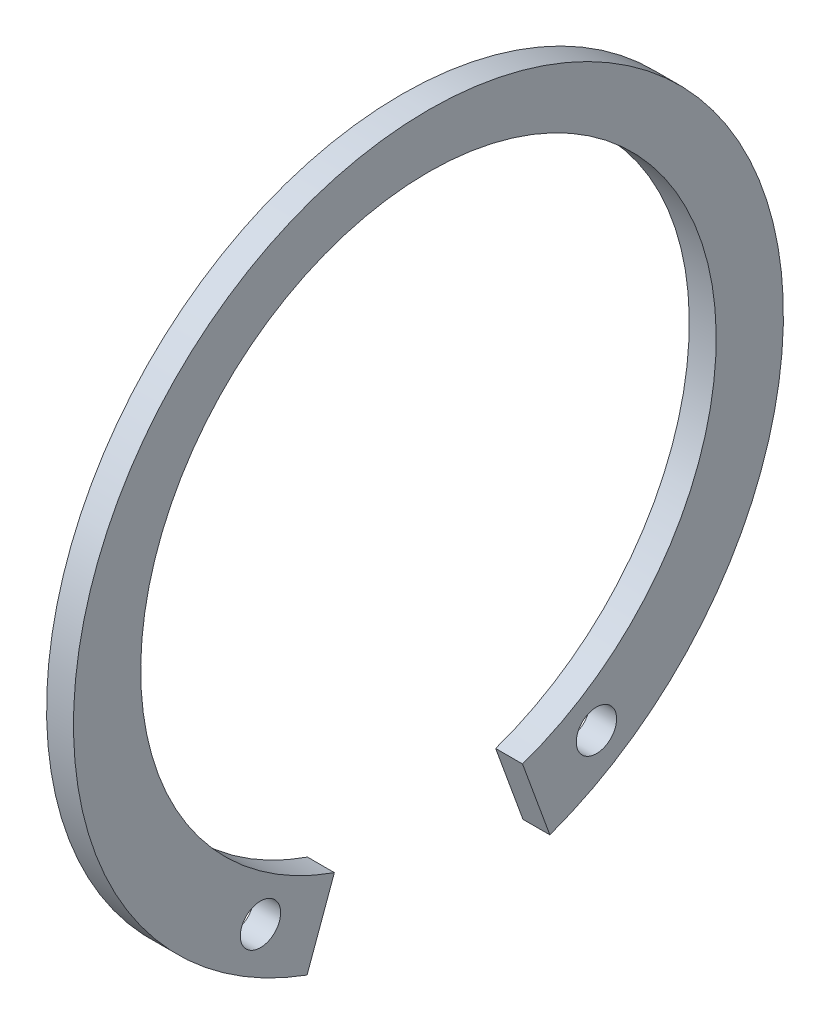
ISO-10303-21;
HEADER;
FILE_DESCRIPTION(('STEP AP214'),'2;1');
FILE_NAME('part.step','',(''),(''),'','','');
FILE_SCHEMA(('AUTOMOTIVE_DESIGN { 1 0 10303 214 1 1 1 1 }'));
ENDSEC;
DATA;
#1=APPLICATION_CONTEXT('core data for automotive mechanical design processes');
#2=APPLICATION_PROTOCOL_DEFINITION('international standard','automotive_design',2000,#1);
#3=PRODUCT_CONTEXT('',#1,'mechanical');
#4=PRODUCT('Part','Part','',(#3));
#5=PRODUCT_RELATED_PRODUCT_CATEGORY('part','',(#4));
#6=PRODUCT_DEFINITION_FORMATION('','',#4);
#7=PRODUCT_DEFINITION_CONTEXT('part definition',#1,'design');
#8=PRODUCT_DEFINITION('design','',#6,#7);
#9=PRODUCT_DEFINITION_SHAPE('','',#8);
#10=(LENGTH_UNIT() NAMED_UNIT(*) SI_UNIT(.MILLI.,.METRE.));
#11=(NAMED_UNIT(*) PLANE_ANGLE_UNIT() SI_UNIT($,.RADIAN.));
#12=(NAMED_UNIT(*) SI_UNIT($,.STERADIAN.) SOLID_ANGLE_UNIT());
#13=UNCERTAINTY_MEASURE_WITH_UNIT(LENGTH_MEASURE(1.E-05),#10,'distance_accuracy_value','');
#14=(GEOMETRIC_REPRESENTATION_CONTEXT(3) GLOBAL_UNCERTAINTY_ASSIGNED_CONTEXT((#13)) GLOBAL_UNIT_ASSIGNED_CONTEXT((#10,
#11,#12)) REPRESENTATION_CONTEXT('',''));
#15=CARTESIAN_POINT('',(0.,0.,0.));
#16=DIRECTION('',(0.,0.,1.));
#17=DIRECTION('',(1.,0.,0.));
#18=AXIS2_PLACEMENT_3D('',#15,#16,#17);
#19=CARTESIAN_POINT('',(1.,-10.447131430661,5.1452301515176));
#20=DIRECTION('',(0.,-0.897101691634703,0.441824122096287));
#21=DIRECTION('',(0.,-0.441824122096287,-0.897101691634703));
#22=AXIS2_PLACEMENT_3D('',#19,#20,#21);
#23=PLANE('',#22);
#24=DIRECTION('',(0.,0.441824122096287,0.897101691634703));
#25=VECTOR('',#24,1.);
#26=CARTESIAN_POINT('',(0.,-10.447131430661,5.1452301515176));
#27=LINE('',#26,#25);
#28=CARTESIAN_POINT('',(0.,-11.0079291474902,4.00655855059777));
#29=VERTEX_POINT('',#28);
#30=CARTESIAN_POINT('',(0.,-10.9897215948147,4.04352807192735));
#31=VERTEX_POINT('',#30);
#32=EDGE_CURVE('E153',#29,#31,#27,.T.);
#33=ORIENTED_EDGE('',*,*,#32,.T.);
#34=DIRECTION('',(-1.,0.,0.));
#35=VECTOR('',#34,1.);
#36=CARTESIAN_POINT('',(1.,-10.9897215948147,4.04352807192735));
#37=LINE('',#36,#35);
#38=CARTESIAN_POINT('',(1.,-10.9897215948147,4.04352807192735));
#39=VERTEX_POINT('',#38);
#40=EDGE_CURVE('E11',#39,#31,#37,.T.);
#41=ORIENTED_EDGE('',*,*,#40,.F.);
#42=DIRECTION('',(0.,0.441824122096287,0.897101691634703));
#43=VECTOR('',#42,1.);
#44=CARTESIAN_POINT('',(1.,-10.447131430661,5.1452301515176));
#45=LINE('',#44,#43);
#46=CARTESIAN_POINT('',(1.,-11.0079291474902,4.00655855059777));
#47=VERTEX_POINT('',#46);
#48=EDGE_CURVE('E196',#47,#39,#45,.T.);
#49=ORIENTED_EDGE('',*,*,#48,.F.);
#50=DIRECTION('',(-1.,0.,0.));
#51=VECTOR('',#50,1.);
#52=CARTESIAN_POINT('',(1.,-11.0079291474902,4.00655855059777));
#53=LINE('',#52,#51);
#54=EDGE_CURVE('E65',#47,#29,#53,.T.);
#55=ORIENTED_EDGE('',*,*,#54,.T.);
#56=EDGE_LOOP('',(#33,#41,#49,#55));
#57=FACE_BOUND('',#56,.T.);
#58=ADVANCED_FACE('F47',(#57),#23,.F.);
#59=CARTESIAN_POINT('',(1.,0.,0.));
#60=DIRECTION('',(-1.,0.,0.));
#61=DIRECTION('',(0.,0.,1.));
#62=AXIS2_PLACEMENT_3D('',#59,#60,#61);
#63=CYLINDRICAL_SURFACE('',#62,11.71);
#64=CARTESIAN_POINT('',(0.,0.,0.));
#65=DIRECTION('',(1.,0.,0.));
#66=DIRECTION('',(0.,0.,-1.));
#67=AXIS2_PLACEMENT_3D('',#64,#65,#66);
#68=CIRCLE('',#67,11.71);
#69=CARTESIAN_POINT('',(0.,-11.003800589403,4.00505587834359));
#70=VERTEX_POINT('',#69);
#71=EDGE_CURVE('E156',#31,#70,#68,.T.);
#72=ORIENTED_EDGE('',*,*,#71,.T.);
#73=DIRECTION('',(-1.,0.,0.));
#74=VECTOR('',#73,1.);
#75=CARTESIAN_POINT('',(1.,-11.003800589403,4.00505587834359));
#76=LINE('',#75,#74);
#77=CARTESIAN_POINT('',(1.,-11.003800589403,4.00505587834359));
#78=VERTEX_POINT('',#77);
#79=EDGE_CURVE('E57',#78,#70,#76,.T.);
#80=ORIENTED_EDGE('',*,*,#79,.F.);
#81=CARTESIAN_POINT('',(1.,0.,0.));
#82=DIRECTION('',(1.,0.,0.));
#83=DIRECTION('',(0.,0.,-1.));
#84=AXIS2_PLACEMENT_3D('',#81,#82,#83);
#85=CIRCLE('',#84,11.71);
#86=EDGE_CURVE('E101',#39,#78,#85,.T.);
#87=ORIENTED_EDGE('',*,*,#86,.F.);
#88=ORIENTED_EDGE('',*,*,#40,.T.);
#89=EDGE_LOOP('',(#72,#80,#87,#88));
#90=FACE_BOUND('',#89,.T.);
#91=ADVANCED_FACE('F187',(#90),#63,.T.);
#92=CARTESIAN_POINT('',(1.,0.,0.));
#93=DIRECTION('',(0.,-0.342020143325669,-0.939692620785908));
#94=DIRECTION('',(0.,0.939692620785908,-0.342020143325669));
#95=AXIS2_PLACEMENT_3D('',#92,#93,#94);
#96=PLANE('',#95);
#97=DIRECTION('',(0.,-0.939692620785908,0.342020143325669));
#98=VECTOR('',#97,1.);
#99=CARTESIAN_POINT('',(0.,0.,0.));
#100=LINE('',#99,#98);
#101=CARTESIAN_POINT('',(0.,-9.61191570060641,3.49845120929671));
#102=VERTEX_POINT('',#101);
#103=EDGE_CURVE('E160',#102,#70,#100,.T.);
#104=ORIENTED_EDGE('',*,*,#103,.F.);
#105=DIRECTION('',(-1.,0.,0.));
#106=VECTOR('',#105,1.);
#107=CARTESIAN_POINT('',(1.,-9.61191570060641,3.49845120929671));
#108=LINE('',#107,#106);
#109=CARTESIAN_POINT('',(1.,-9.61191570060641,3.49845120929671));
#110=VERTEX_POINT('',#109);
#111=EDGE_CURVE('E180',#110,#102,#108,.T.);
#112=ORIENTED_EDGE('',*,*,#111,.F.);
#113=DIRECTION('',(0.,-0.939692620785908,0.342020143325669));
#114=VECTOR('',#113,1.);
#115=CARTESIAN_POINT('',(1.,0.,0.));
#116=LINE('',#115,#114);
#117=EDGE_CURVE('E141',#110,#78,#116,.T.);
#118=ORIENTED_EDGE('',*,*,#117,.T.);
#119=ORIENTED_EDGE('',*,*,#79,.T.);
#120=EDGE_LOOP('',(#104,#112,#118,#119));
#121=FACE_BOUND('',#120,.T.);
#122=ADVANCED_FACE('F186',(#121),#96,.T.);
#123=CARTESIAN_POINT('',(1.,0.499999999999999,0.));
#124=DIRECTION('',(-1.,0.,0.));
#125=DIRECTION('',(0.,0.,1.));
#126=AXIS2_PLACEMENT_3D('',#123,#124,#125);
#127=CYLINDRICAL_SURFACE('',#126,10.7);
#128=CARTESIAN_POINT('',(0.,0.499999999999999,0.));
#129=DIRECTION('',(1.,0.,0.));
#130=DIRECTION('',(0.,0.,-1.));
#131=AXIS2_PLACEMENT_3D('',#128,#129,#130);
#132=CIRCLE('',#131,10.7);
#133=CARTESIAN_POINT('',(0.,-9.61191570060643,-3.49845120929665));
#134=VERTEX_POINT('',#133);
#135=EDGE_CURVE('E164',#134,#102,#132,.T.);
#136=ORIENTED_EDGE('',*,*,#135,.F.);
#137=DIRECTION('',(-1.,0.,0.));
#138=VECTOR('',#137,1.);
#139=CARTESIAN_POINT('',(1.,-9.61191570060643,-3.49845120929665));
#140=LINE('',#139,#138);
#141=CARTESIAN_POINT('',(1.,-9.61191570060643,-3.49845120929665));
#142=VERTEX_POINT('',#141);
#143=EDGE_CURVE('E124',#142,#134,#140,.T.);
#144=ORIENTED_EDGE('',*,*,#143,.F.);
#145=CARTESIAN_POINT('',(1.,0.499999999999999,0.));
#146=DIRECTION('',(1.,0.,0.));
#147=DIRECTION('',(0.,0.,-1.));
#148=AXIS2_PLACEMENT_3D('',#145,#146,#147);
#149=CIRCLE('',#148,10.7);
#150=EDGE_CURVE('E137',#142,#110,#149,.T.);
#151=ORIENTED_EDGE('',*,*,#150,.T.);
#152=ORIENTED_EDGE('',*,*,#111,.T.);
#153=EDGE_LOOP('',(#136,#144,#151,#152));
#154=FACE_BOUND('',#153,.T.);
#155=ADVANCED_FACE('F193',(#154),#127,.F.);
#156=CARTESIAN_POINT('',(1.,0.,0.));
#157=DIRECTION('',(0.,-0.342020143325663,0.939692620785911));
#158=DIRECTION('',(0.,-0.939692620785911,-0.342020143325663));
#159=AXIS2_PLACEMENT_3D('',#156,#157,#158);
#160=PLANE('',#159);
#161=DIRECTION('',(0.,0.939692620785911,0.342020143325663));
#162=VECTOR('',#161,1.);
#163=CARTESIAN_POINT('',(0.,0.,0.));
#164=LINE('',#163,#162);
#165=CARTESIAN_POINT('',(0.,-12.403942594374,-4.51466589189875));
#166=VERTEX_POINT('',#165);
#167=EDGE_CURVE('E120',#166,#134,#164,.T.);
#168=ORIENTED_EDGE('',*,*,#167,.F.);
#169=DIRECTION('',(-1.,0.,0.));
#170=VECTOR('',#169,1.);
#171=CARTESIAN_POINT('',(1.,-12.403942594374,-4.51466589189875));
#172=LINE('',#171,#170);
#173=CARTESIAN_POINT('',(1.,-12.403942594374,-4.51466589189875));
#174=VERTEX_POINT('',#173);
#175=EDGE_CURVE('E114',#174,#166,#172,.T.);
#176=ORIENTED_EDGE('',*,*,#175,.F.);
#177=DIRECTION('',(0.,0.939692620785911,0.342020143325663));
#178=VECTOR('',#177,1.);
#179=CARTESIAN_POINT('',(1.,0.,0.));
#180=LINE('',#179,#178);
#181=EDGE_CURVE('E118',#174,#142,#180,.T.);
#182=ORIENTED_EDGE('',*,*,#181,.T.);
#183=ORIENTED_EDGE('',*,*,#143,.T.);
#184=EDGE_LOOP('',(#168,#176,#182,#183));
#185=FACE_BOUND('',#184,.T.);
#186=ADVANCED_FACE('F116',(#185),#160,.T.);
#187=CARTESIAN_POINT('',(1.,0.,0.));
#188=DIRECTION('',(-1.,0.,0.));
#189=DIRECTION('',(0.,0.,1.));
#190=AXIS2_PLACEMENT_3D('',#187,#188,#189);
#191=CYLINDRICAL_SURFACE('',#190,13.2);
#192=CARTESIAN_POINT('',(0.,0.,0.));
#193=DIRECTION('',(1.,0.,0.));
#194=DIRECTION('',(0.,0.,-1.));
#195=AXIS2_PLACEMENT_3D('',#192,#193,#194);
#196=CIRCLE('',#195,13.2);
#197=CARTESIAN_POINT('',(0.,-12.403942594374,4.51466589189883));
#198=VERTEX_POINT('',#197);
#199=EDGE_CURVE('E171',#166,#198,#196,.T.);
#200=ORIENTED_EDGE('',*,*,#199,.T.);
#201=DIRECTION('',(-1.,0.,0.));
#202=VECTOR('',#201,1.);
#203=CARTESIAN_POINT('',(1.,-12.403942594374,4.51466589189883));
#204=LINE('',#203,#202);
#205=CARTESIAN_POINT('',(1.,-12.403942594374,4.51466589189883));
#206=VERTEX_POINT('',#205);
#207=EDGE_CURVE('E89',#206,#198,#204,.T.);
#208=ORIENTED_EDGE('',*,*,#207,.F.);
#209=CARTESIAN_POINT('',(1.,0.,0.));
#210=DIRECTION('',(1.,0.,0.));
#211=DIRECTION('',(0.,0.,-1.));
#212=AXIS2_PLACEMENT_3D('',#209,#210,#211);
#213=CIRCLE('',#212,13.2);
#214=EDGE_CURVE('E126',#174,#206,#213,.T.);
#215=ORIENTED_EDGE('',*,*,#214,.F.);
#216=ORIENTED_EDGE('',*,*,#175,.T.);
#217=EDGE_LOOP('',(#200,#208,#215,#216));
#218=FACE_BOUND('',#217,.T.);
#219=ADVANCED_FACE('F127',(#218),#191,.T.);
#220=CARTESIAN_POINT('',(1.,-9.90454126650731,6.24693223110782));
#221=DIRECTION('',(-1.,0.,0.));
#222=DIRECTION('',(0.,0.,1.));
#223=AXIS2_PLACEMENT_3D('',#220,#221,#222);
#224=CYLINDRICAL_SURFACE('',#223,0.75);
#225=CARTESIAN_POINT('',(1.,-9.90454126650731,6.24693223110782));
#226=DIRECTION('',(1.,0.,0.));
#227=DIRECTION('',(0.,0.,-1.));
#228=AXIS2_PLACEMENT_3D('',#225,#226,#227);
#229=CIRCLE('',#228,0.75);
#230=CARTESIAN_POINT('',(1.,-9.90454126650731,5.49693223110783));
#231=VERTEX_POINT('',#230);
#232=EDGE_CURVE('E201',#231,#231,#229,.T.);
#233=ORIENTED_EDGE('',*,*,#232,.T.);
#234=EDGE_LOOP('',(#233));
#235=FACE_BOUND('',#234,.T.);
#236=CARTESIAN_POINT('',(0.,-9.90454126650731,6.24693223110782));
#237=DIRECTION('',(1.,0.,0.));
#238=DIRECTION('',(0.,0.,-1.));
#239=AXIS2_PLACEMENT_3D('',#236,#237,#238);
#240=CIRCLE('',#239,0.75);
#241=CARTESIAN_POINT('',(0.,-9.90454126650731,5.49693223110783));
#242=VERTEX_POINT('',#241);
#243=EDGE_CURVE('E149',#242,#242,#240,.T.);
#244=ORIENTED_EDGE('',*,*,#243,.F.);
#245=EDGE_LOOP('',(#244));
#246=FACE_BOUND('',#245,.T.);
#247=ADVANCED_FACE('F216',(#235,#246),#224,.F.);
#248=CARTESIAN_POINT('',(1.,-9.90454126650731,-6.24693223));
#249=DIRECTION('',(-1.,0.,0.));
#250=DIRECTION('',(0.,0.,1.));
#251=AXIS2_PLACEMENT_3D('',#248,#249,#250);
#252=CYLINDRICAL_SURFACE('',#251,0.75);
#253=CARTESIAN_POINT('',(1.,-9.90454126650731,-6.24693223));
#254=DIRECTION('',(1.,0.,0.));
#255=DIRECTION('',(0.,0.,-1.));
#256=AXIS2_PLACEMENT_3D('',#253,#254,#255);
#257=CIRCLE('',#256,0.75);
#258=CARTESIAN_POINT('',(1.,-9.90454126650731,-6.99693223));
#259=VERTEX_POINT('',#258);
#260=EDGE_CURVE('E205',#259,#259,#257,.T.);
#261=ORIENTED_EDGE('',*,*,#260,.T.);
#262=EDGE_LOOP('',(#261));
#263=FACE_BOUND('',#262,.T.);
#264=CARTESIAN_POINT('',(0.,-9.90454126650731,-6.24693223));
#265=DIRECTION('',(1.,0.,0.));
#266=DIRECTION('',(0.,0.,-1.));
#267=AXIS2_PLACEMENT_3D('',#264,#265,#266);
#268=CIRCLE('',#267,0.75);
#269=CARTESIAN_POINT('',(0.,-9.90454126650731,-6.99693223));
#270=VERTEX_POINT('',#269);
#271=EDGE_CURVE('E145',#270,#270,#268,.T.);
#272=ORIENTED_EDGE('',*,*,#271,.F.);
#273=EDGE_LOOP('',(#272));
#274=FACE_BOUND('',#273,.T.);
#275=ADVANCED_FACE('F49',(#263,#274),#252,.F.);
#276=EDGE_CURVE('E165',#29,#198,#100,.T.);
#277=ORIENTED_EDGE('',*,*,#276,.F.);
#278=ORIENTED_EDGE('',*,*,#54,.F.);
#279=EDGE_CURVE('E131',#47,#206,#116,.T.);
#280=ORIENTED_EDGE('',*,*,#279,.T.);
#281=ORIENTED_EDGE('',*,*,#207,.T.);
#282=EDGE_LOOP('',(#277,#278,#280,#281));
#283=FACE_BOUND('',#282,.T.);
#284=ADVANCED_FACE('F199',(#283),#96,.T.);
#285=CARTESIAN_POINT('',(1.,0.,0.));
#286=DIRECTION('',(1.,0.,0.));
#287=DIRECTION('',(0.,0.,-1.));
#288=AXIS2_PLACEMENT_3D('',#285,#286,#287);
#289=PLANE('',#288);
#290=ORIENTED_EDGE('',*,*,#260,.F.);
#291=EDGE_LOOP('',(#290));
#292=FACE_BOUND('',#291,.T.);
#293=ORIENTED_EDGE('',*,*,#232,.F.);
#294=EDGE_LOOP('',(#293));
#295=FACE_BOUND('',#294,.T.);
#296=ORIENTED_EDGE('',*,*,#48,.T.);
#297=ORIENTED_EDGE('',*,*,#86,.T.);
#298=ORIENTED_EDGE('',*,*,#117,.F.);
#299=ORIENTED_EDGE('',*,*,#150,.F.);
#300=ORIENTED_EDGE('',*,*,#181,.F.);
#301=ORIENTED_EDGE('',*,*,#214,.T.);
#302=ORIENTED_EDGE('',*,*,#279,.F.);
#303=EDGE_LOOP('',(#296,#297,#298,#299,#300,#301,#302));
#304=FACE_BOUND('',#303,.T.);
#305=ADVANCED_FACE('F134',(#292,#295,#304),#289,.T.);
#306=CARTESIAN_POINT('',(0.,0.,0.));
#307=DIRECTION('',(1.,0.,0.));
#308=DIRECTION('',(0.,0.,-1.));
#309=AXIS2_PLACEMENT_3D('',#306,#307,#308);
#310=PLANE('',#309);
#311=ORIENTED_EDGE('',*,*,#271,.T.);
#312=EDGE_LOOP('',(#311));
#313=FACE_BOUND('',#312,.T.);
#314=ORIENTED_EDGE('',*,*,#243,.T.);
#315=EDGE_LOOP('',(#314));
#316=FACE_BOUND('',#315,.T.);
#317=ORIENTED_EDGE('',*,*,#32,.F.);
#318=ORIENTED_EDGE('',*,*,#276,.T.);
#319=ORIENTED_EDGE('',*,*,#199,.F.);
#320=ORIENTED_EDGE('',*,*,#167,.T.);
#321=ORIENTED_EDGE('',*,*,#135,.T.);
#322=ORIENTED_EDGE('',*,*,#103,.T.);
#323=ORIENTED_EDGE('',*,*,#71,.F.);
#324=EDGE_LOOP('',(#317,#318,#319,#320,#321,#322,#323));
#325=FACE_BOUND('',#324,.T.);
#326=ADVANCED_FACE('F190',(#313,#316,#325),#310,.F.);
#327=CLOSED_SHELL('',(#58,#91,#122,#155,#186,#219,#247,#275,#284,#305,#326));
#328=MANIFOLD_SOLID_BREP('B2',#327);
#329=ADVANCED_BREP_SHAPE_REPRESENTATION('',(#18,#328),#14);
#330=SHAPE_DEFINITION_REPRESENTATION(#9,#329);
ENDSEC;
END-ISO-10303-21;
